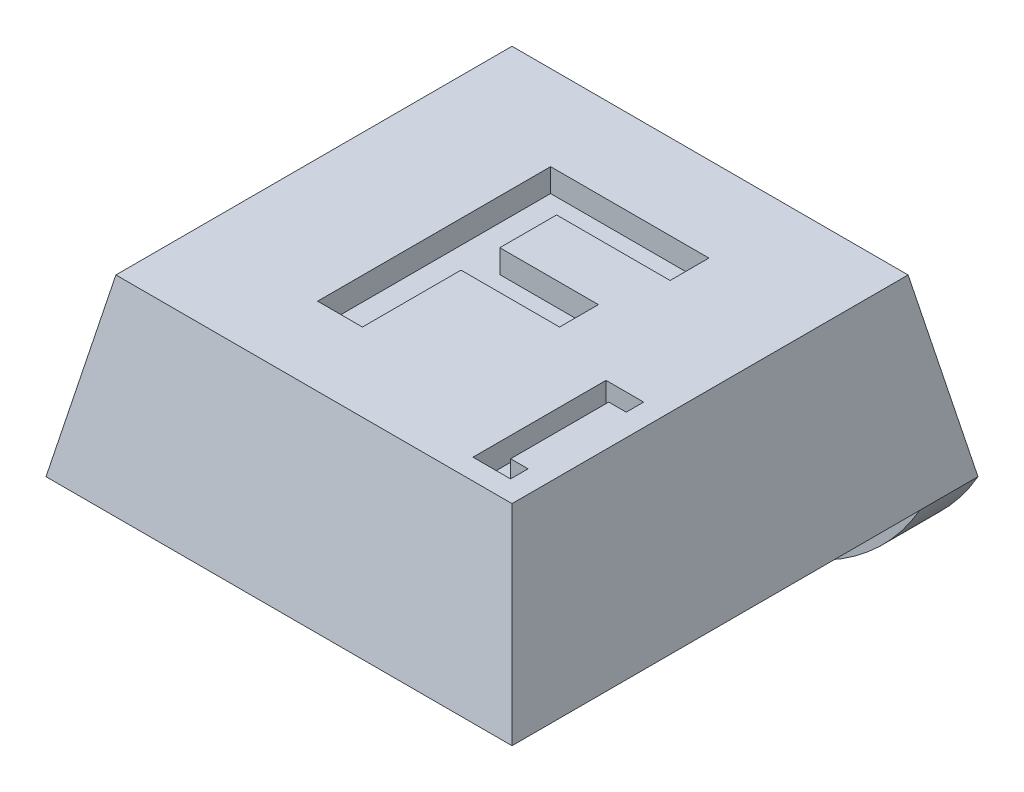
ISO-10303-21;
HEADER;
FILE_DESCRIPTION(('STEP AP214'),'2;1');
FILE_NAME('part.step','',(''),(''),'','','');
FILE_SCHEMA(('AUTOMOTIVE_DESIGN { 1 0 10303 214 1 1 1 1 }'));
ENDSEC;
DATA;
#1=APPLICATION_CONTEXT('core data for automotive mechanical design processes');
#2=APPLICATION_PROTOCOL_DEFINITION('international standard','automotive_design',2000,#1);
#3=PRODUCT_CONTEXT('',#1,'mechanical');
#4=PRODUCT('Part','Part','',(#3));
#5=PRODUCT_RELATED_PRODUCT_CATEGORY('part','',(#4));
#6=PRODUCT_DEFINITION_FORMATION('','',#4);
#7=PRODUCT_DEFINITION_CONTEXT('part definition',#1,'design');
#8=PRODUCT_DEFINITION('design','',#6,#7);
#9=PRODUCT_DEFINITION_SHAPE('','',#8);
#10=(LENGTH_UNIT() NAMED_UNIT(*) SI_UNIT(.MILLI.,.METRE.));
#11=(NAMED_UNIT(*) PLANE_ANGLE_UNIT() SI_UNIT($,.RADIAN.));
#12=(NAMED_UNIT(*) SI_UNIT($,.STERADIAN.) SOLID_ANGLE_UNIT());
#13=UNCERTAINTY_MEASURE_WITH_UNIT(LENGTH_MEASURE(1.E-05),#10,'distance_accuracy_value','');
#14=(GEOMETRIC_REPRESENTATION_CONTEXT(3) GLOBAL_UNCERTAINTY_ASSIGNED_CONTEXT((#13)) GLOBAL_UNIT_ASSIGNED_CONTEXT((#10,
#11,#12)) REPRESENTATION_CONTEXT('',''));
#15=CARTESIAN_POINT('',(0.,0.,0.));
#16=DIRECTION('',(0.,0.,1.));
#17=DIRECTION('',(1.,0.,0.));
#18=AXIS2_PLACEMENT_3D('',#15,#16,#17);
#19=CARTESIAN_POINT('',(0.,3.,0.));
#20=DIRECTION('',(0.,-1.,0.));
#21=DIRECTION('',(0.,0.,-1.));
#22=AXIS2_PLACEMENT_3D('',#19,#20,#21);
#23=PLANE('',#22);
#24=DIRECTION('',(-1.,0.,0.));
#25=VECTOR('',#24,1.);
#26=CARTESIAN_POINT('',(3.49080595744267,3.,-1.94116936627452));
#27=LINE('',#26,#25);
#28=CARTESIAN_POINT('',(3.49080595744267,3.,-1.94116936627452));
#29=VERTEX_POINT('',#28);
#30=CARTESIAN_POINT('',(2.7215751882119,3.,-1.94116936627452));
#31=VERTEX_POINT('',#30);
#32=EDGE_CURVE('E66',#29,#31,#27,.T.);
#33=ORIENTED_EDGE('',*,*,#32,.T.);
#34=DIRECTION('',(0.,0.,-1.));
#35=VECTOR('',#34,1.);
#36=CARTESIAN_POINT('',(2.7215751882119,3.,-1.94116936627452));
#37=LINE('',#36,#35);
#38=CARTESIAN_POINT('',(2.7215751882119,3.,-5.94116936627452));
#39=VERTEX_POINT('',#38);
#40=EDGE_CURVE('E239',#31,#39,#37,.T.);
#41=ORIENTED_EDGE('',*,*,#40,.T.);
#42=DIRECTION('',(1.,0.,0.));
#43=VECTOR('',#42,1.);
#44=CARTESIAN_POINT('',(2.7215751882119,3.,-5.94116936627452));
#45=LINE('',#44,#43);
#46=CARTESIAN_POINT('',(5.43952390616062,3.,-5.94116936627452));
#47=VERTEX_POINT('',#46);
#48=EDGE_CURVE('E281',#39,#47,#45,.T.);
#49=ORIENTED_EDGE('',*,*,#48,.T.);
#50=DIRECTION('',(0.,0.,1.));
#51=VECTOR('',#50,1.);
#52=CARTESIAN_POINT('',(5.43952390616062,3.,-5.94116936627452));
#53=LINE('',#52,#51);
#54=CARTESIAN_POINT('',(5.43952390616062,3.,-5.27450269960785));
#55=VERTEX_POINT('',#54);
#56=EDGE_CURVE('E285',#47,#55,#53,.T.);
#57=ORIENTED_EDGE('',*,*,#56,.T.);
#58=DIRECTION('',(-1.,0.,0.));
#59=VECTOR('',#58,1.);
#60=CARTESIAN_POINT('',(5.43952390616062,3.,-5.27450269960785));
#61=LINE('',#60,#59);
#62=CARTESIAN_POINT('',(3.49080595744267,3.,-5.27450269960785));
#63=VERTEX_POINT('',#62);
#64=EDGE_CURVE('E289',#55,#63,#61,.T.);
#65=ORIENTED_EDGE('',*,*,#64,.T.);
#66=DIRECTION('',(0.,0.,1.));
#67=VECTOR('',#66,1.);
#68=CARTESIAN_POINT('',(3.49080595744267,3.,-5.27450269960785));
#69=LINE('',#68,#67);
#70=CARTESIAN_POINT('',(3.49080595744267,3.,-4.30014372524888));
#71=VERTEX_POINT('',#70);
#72=EDGE_CURVE('E293',#63,#71,#69,.T.);
#73=ORIENTED_EDGE('',*,*,#72,.T.);
#74=DIRECTION('',(1.,0.,0.));
#75=VECTOR('',#74,1.);
#76=CARTESIAN_POINT('',(3.49080595744267,3.,-4.30014372524888));
#77=LINE('',#76,#75);
#78=CARTESIAN_POINT('',(5.18311364975036,3.,-4.30014372524888));
#79=VERTEX_POINT('',#78);
#80=EDGE_CURVE('E297',#71,#79,#77,.T.);
#81=ORIENTED_EDGE('',*,*,#80,.T.);
#82=DIRECTION('',(0.,0.,1.));
#83=VECTOR('',#82,1.);
#84=CARTESIAN_POINT('',(5.18311364975036,3.,-4.30014372524888));
#85=LINE('',#84,#83);
#86=CARTESIAN_POINT('',(5.18311364975036,3.,-3.63347705858221));
#87=VERTEX_POINT('',#86);
#88=EDGE_CURVE('E301',#79,#87,#85,.T.);
#89=ORIENTED_EDGE('',*,*,#88,.T.);
#90=DIRECTION('',(-1.,0.,0.));
#91=VECTOR('',#90,1.);
#92=CARTESIAN_POINT('',(5.18311364975036,3.,-3.63347705858221));
#93=LINE('',#92,#91);
#94=CARTESIAN_POINT('',(3.49080595744267,3.,-3.63347705858221));
#95=VERTEX_POINT('',#94);
#96=EDGE_CURVE('E305',#87,#95,#93,.T.);
#97=ORIENTED_EDGE('',*,*,#96,.T.);
#98=DIRECTION('',(0.,0.,1.));
#99=VECTOR('',#98,1.);
#100=CARTESIAN_POINT('',(3.49080595744267,3.,-3.63347705858221));
#101=LINE('',#100,#99);
#102=EDGE_CURVE('E250',#95,#29,#101,.T.);
#103=ORIENTED_EDGE('',*,*,#102,.T.);
#104=EDGE_LOOP('',(#33,#41,#49,#57,#65,#73,#81,#89,#97,#103));
#105=FACE_BOUND('',#104,.T.);
#106=DIRECTION('',(-1.,0.,0.));
#107=VECTOR('',#106,1.);
#108=CARTESIAN_POINT('',(11.,3.,-0.6));
#109=LINE('',#108,#107);
#110=CARTESIAN_POINT('',(7.4,3.,-0.6));
#111=VERTEX_POINT('',#110);
#112=CARTESIAN_POINT('',(0.6,3.,-0.6));
#113=VERTEX_POINT('',#112);
#114=EDGE_CURVE('E366',#111,#113,#109,.T.);
#115=ORIENTED_EDGE('',*,*,#114,.F.);
#116=DIRECTION('',(0.,0.,1.));
#117=VECTOR('',#116,1.);
#118=CARTESIAN_POINT('',(7.4,3.,-8.));
#119=LINE('',#118,#117);
#120=CARTESIAN_POINT('',(7.4,3.,-7.4));
#121=VERTEX_POINT('',#120);
#122=EDGE_CURVE('E379',#121,#111,#119,.T.);
#123=ORIENTED_EDGE('',*,*,#122,.F.);
#124=DIRECTION('',(-1.,0.,0.));
#125=VECTOR('',#124,1.);
#126=CARTESIAN_POINT('',(11.,3.,-7.4));
#127=LINE('',#126,#125);
#128=CARTESIAN_POINT('',(0.599999999999999,3.,-7.4));
#129=VERTEX_POINT('',#128);
#130=EDGE_CURVE('E362',#121,#129,#127,.T.);
#131=ORIENTED_EDGE('',*,*,#130,.T.);
#132=DIRECTION('',(0.,0.,1.));
#133=VECTOR('',#132,1.);
#134=CARTESIAN_POINT('',(0.6,3.,-8.));
#135=LINE('',#134,#133);
#136=EDGE_CURVE('E382',#129,#113,#135,.T.);
#137=ORIENTED_EDGE('',*,*,#136,.T.);
#138=EDGE_LOOP('',(#115,#123,#131,#137));
#139=FACE_BOUND('',#138,.T.);
#140=DIRECTION('',(-1.,0.,0.));
#141=VECTOR('',#140,1.);
#142=CARTESIAN_POINT('',(7.02065720821508,3.,-0.955347226257792));
#143=LINE('',#142,#141);
#144=CARTESIAN_POINT('',(7.02065720821508,3.,-0.955347226257792));
#145=VERTEX_POINT('',#144);
#146=CARTESIAN_POINT('',(6.37450336206124,3.,-0.955347226257792));
#147=VERTEX_POINT('',#146);
#148=EDGE_CURVE('E58',#145,#147,#143,.T.);
#149=ORIENTED_EDGE('',*,*,#148,.T.);
#150=DIRECTION('',(0.,0.,-1.));
#151=VECTOR('',#150,1.);
#152=CARTESIAN_POINT('',(6.37450336206124,3.,-0.955347226257792));
#153=LINE('',#152,#151);
#154=CARTESIAN_POINT('',(6.37450336206124,3.,-3.23996261087318));
#155=VERTEX_POINT('',#154);
#156=EDGE_CURVE('E233',#147,#155,#153,.T.);
#157=ORIENTED_EDGE('',*,*,#156,.T.);
#158=DIRECTION('',(1.,0.,0.));
#159=VECTOR('',#158,1.);
#160=CARTESIAN_POINT('',(6.37450336206124,3.,-3.23996261087318));
#161=LINE('',#160,#159);
#162=CARTESIAN_POINT('',(7.02065720821508,3.,-3.23996261087318));
#163=VERTEX_POINT('',#162);
#164=EDGE_CURVE('E486',#155,#163,#161,.T.);
#165=ORIENTED_EDGE('',*,*,#164,.T.);
#166=DIRECTION('',(0.,0.,1.));
#167=VECTOR('',#166,1.);
#168=CARTESIAN_POINT('',(7.02065720821508,3.,-3.23996261087318));
#169=LINE('',#168,#167);
#170=CARTESIAN_POINT('',(7.02065720821508,3.,-2.93996261087318));
#171=VERTEX_POINT('',#170);
#172=EDGE_CURVE('E494',#163,#171,#169,.T.);
#173=ORIENTED_EDGE('',*,*,#172,.T.);
#174=DIRECTION('',(-1.,0.,0.));
#175=VECTOR('',#174,1.);
#176=CARTESIAN_POINT('',(7.02065720821508,3.,-2.93996261087318));
#177=LINE('',#176,#175);
#178=CARTESIAN_POINT('',(6.72065720821508,3.,-2.93996261087318));
#179=VERTEX_POINT('',#178);
#180=EDGE_CURVE('E498',#171,#179,#177,.T.);
#181=ORIENTED_EDGE('',*,*,#180,.T.);
#182=DIRECTION('',(0.,0.,1.));
#183=VECTOR('',#182,1.);
#184=CARTESIAN_POINT('',(6.72065720821508,3.,-2.93996261087318));
#185=LINE('',#184,#183);
#186=CARTESIAN_POINT('',(6.72065720821508,3.,-1.25534722625779));
#187=VERTEX_POINT('',#186);
#188=EDGE_CURVE('E502',#179,#187,#185,.T.);
#189=ORIENTED_EDGE('',*,*,#188,.T.);
#190=DIRECTION('',(1.,0.,0.));
#191=VECTOR('',#190,1.);
#192=CARTESIAN_POINT('',(6.72065720821508,3.,-1.25534722625779));
#193=LINE('',#192,#191);
#194=CARTESIAN_POINT('',(7.02065720821508,3.,-1.25534722625779));
#195=VERTEX_POINT('',#194);
#196=EDGE_CURVE('E506',#187,#195,#193,.T.);
#197=ORIENTED_EDGE('',*,*,#196,.T.);
#198=DIRECTION('',(0.,0.,1.));
#199=VECTOR('',#198,1.);
#200=CARTESIAN_POINT('',(7.02065720821508,3.,-1.25534722625779));
#201=LINE('',#200,#199);
#202=EDGE_CURVE('E229',#195,#145,#201,.T.);
#203=ORIENTED_EDGE('',*,*,#202,.T.);
#204=EDGE_LOOP('',(#149,#157,#165,#173,#181,#189,#197,#203));
#205=FACE_BOUND('',#204,.T.);
#206=ADVANCED_FACE('F42',(#105,#139,#205),#23,.F.);
#207=CARTESIAN_POINT('',(8.,0.,-8.));
#208=DIRECTION('',(-0.98058067569092,-0.196116135138184,0.));
#209=DIRECTION('',(0.196116135138184,-0.98058067569092,0.));
#210=AXIS2_PLACEMENT_3D('',#207,#208,#209);
#211=PLANE('',#210);
#212=DIRECTION('',(-0.192450089729875,0.962250448649376,-0.192450089729875));
#213=VECTOR('',#212,1.);
#214=CARTESIAN_POINT('',(7.7037037037037,1.48148148148148,-0.296296296296296));
#215=LINE('',#214,#213);
#216=CARTESIAN_POINT('',(8.,0.,0.));
#217=VERTEX_POINT('',#216);
#218=EDGE_CURVE('E376',#217,#111,#215,.T.);
#219=ORIENTED_EDGE('',*,*,#218,.F.);
#220=DIRECTION('',(0.,0.,-1.));
#221=VECTOR('',#220,1.);
#222=CARTESIAN_POINT('',(8.,0.,0.));
#223=LINE('',#222,#221);
#224=CARTESIAN_POINT('',(8.,0.,-7.));
#225=VERTEX_POINT('',#224);
#226=EDGE_CURVE('E395',#217,#225,#223,.T.);
#227=ORIENTED_EDGE('',*,*,#226,.T.);
#228=DIRECTION('',(0.,0.,1.));
#229=VECTOR('',#228,1.);
#230=CARTESIAN_POINT('',(8.,0.,-8.));
#231=LINE('',#230,#229);
#232=CARTESIAN_POINT('',(8.,0.,-8.));
#233=VERTEX_POINT('',#232);
#234=EDGE_CURVE('E341',#233,#225,#231,.T.);
#235=ORIENTED_EDGE('',*,*,#234,.F.);
#236=DIRECTION('',(0.192450089729875,-0.962250448649376,-0.192450089729875));
#237=VECTOR('',#236,1.);
#238=CARTESIAN_POINT('',(8.,0.,-8.));
#239=LINE('',#238,#237);
#240=EDGE_CURVE('E369',#121,#233,#239,.T.);
#241=ORIENTED_EDGE('',*,*,#240,.F.);
#242=ORIENTED_EDGE('',*,*,#122,.T.);
#243=EDGE_LOOP('',(#219,#227,#235,#241,#242));
#244=FACE_BOUND('',#243,.T.);
#245=ADVANCED_FACE('F468',(#244),#211,.F.);
#246=CARTESIAN_POINT('',(0.,0.,-8.));
#247=DIRECTION('',(0.98058067569092,-0.196116135138184,0.));
#248=DIRECTION('',(0.196116135138184,0.98058067569092,0.));
#249=AXIS2_PLACEMENT_3D('',#246,#247,#248);
#250=PLANE('',#249);
#251=DIRECTION('',(-0.192450089729875,-0.962250448649376,0.192450089729875));
#252=VECTOR('',#251,1.);
#253=CARTESIAN_POINT('',(0.296296296296296,1.48148148148148,-0.296296296296296));
#254=LINE('',#253,#252);
#255=CARTESIAN_POINT('',(0.,0.,0.));
#256=VERTEX_POINT('',#255);
#257=EDGE_CURVE('E423',#113,#256,#254,.T.);
#258=ORIENTED_EDGE('',*,*,#257,.F.);
#259=ORIENTED_EDGE('',*,*,#136,.F.);
#260=DIRECTION('',(0.192450089729875,0.962250448649376,0.192450089729875));
#261=VECTOR('',#260,1.);
#262=CARTESIAN_POINT('',(0.,0.,-8.));
#263=LINE('',#262,#261);
#264=CARTESIAN_POINT('',(0.,0.,-8.));
#265=VERTEX_POINT('',#264);
#266=EDGE_CURVE('E394',#265,#129,#263,.T.);
#267=ORIENTED_EDGE('',*,*,#266,.F.);
#268=DIRECTION('',(0.,0.,1.));
#269=VECTOR('',#268,1.);
#270=CARTESIAN_POINT('',(0.,0.,0.));
#271=LINE('',#270,#269);
#272=CARTESIAN_POINT('',(0.,0.,-7.));
#273=VERTEX_POINT('',#272);
#274=EDGE_CURVE('E399',#265,#273,#271,.T.);
#275=ORIENTED_EDGE('',*,*,#274,.T.);
#276=EDGE_CURVE('E386',#273,#256,#271,.T.);
#277=ORIENTED_EDGE('',*,*,#276,.T.);
#278=EDGE_LOOP('',(#258,#259,#267,#275,#277));
#279=FACE_BOUND('',#278,.T.);
#280=ADVANCED_FACE('F448',(#279),#250,.F.);
#281=CARTESIAN_POINT('',(0.,0.,0.));
#282=DIRECTION('',(0.,-1.,0.));
#283=DIRECTION('',(0.,0.,-1.));
#284=AXIS2_PLACEMENT_3D('',#281,#282,#283);
#285=PLANE('',#284);
#286=DIRECTION('',(-1.,0.,0.));
#287=VECTOR('',#286,1.);
#288=CARTESIAN_POINT('',(0.,0.,-7.));
#289=LINE('',#288,#287);
#290=EDGE_CURVE('E347',#225,#273,#289,.T.);
#291=ORIENTED_EDGE('',*,*,#290,.F.);
#292=ORIENTED_EDGE('',*,*,#226,.F.);
#293=DIRECTION('',(1.,0.,0.));
#294=VECTOR('',#293,1.);
#295=CARTESIAN_POINT('',(0.,0.,0.));
#296=LINE('',#295,#294);
#297=EDGE_CURVE('E396',#256,#217,#296,.T.);
#298=ORIENTED_EDGE('',*,*,#297,.F.);
#299=ORIENTED_EDGE('',*,*,#276,.F.);
#300=EDGE_LOOP('',(#291,#292,#298,#299));
#301=FACE_BOUND('',#300,.T.);
#302=CARTESIAN_POINT('',(4.,0.,-3.75));
#303=DIRECTION('',(0.,-1.,0.));
#304=DIRECTION('',(0.,0.,-1.));
#305=AXIS2_PLACEMENT_3D('',#302,#303,#304);
#306=CIRCLE('',#305,1.8);
#307=CARTESIAN_POINT('',(4.,0.,-5.55));
#308=VERTEX_POINT('',#307);
#309=EDGE_CURVE('E351',#308,#308,#306,.T.);
#310=ORIENTED_EDGE('',*,*,#309,.F.);
#311=EDGE_LOOP('',(#310));
#312=FACE_BOUND('',#311,.T.);
#313=ADVANCED_FACE('F463',(#301,#312),#285,.T.);
#314=CARTESIAN_POINT('',(11.,3.,-7.4));
#315=DIRECTION('',(0.,0.196116135138184,-0.98058067569092));
#316=DIRECTION('',(0.,0.98058067569092,0.196116135138184));
#317=AXIS2_PLACEMENT_3D('',#314,#315,#316);
#318=PLANE('',#317);
#319=ORIENTED_EDGE('',*,*,#240,.T.);
#320=DIRECTION('',(-1.,0.,0.));
#321=VECTOR('',#320,1.);
#322=CARTESIAN_POINT('',(0.,0.,-8.));
#323=LINE('',#322,#321);
#324=EDGE_CURVE('E390',#233,#265,#323,.T.);
#325=ORIENTED_EDGE('',*,*,#324,.T.);
#326=ORIENTED_EDGE('',*,*,#266,.T.);
#327=ORIENTED_EDGE('',*,*,#130,.F.);
#328=EDGE_LOOP('',(#319,#325,#326,#327));
#329=FACE_BOUND('',#328,.T.);
#330=ADVANCED_FACE('F443',(#329),#318,.T.);
#331=CARTESIAN_POINT('',(11.,0.,0.));
#332=DIRECTION('',(0.,0.196116135138184,0.98058067569092));
#333=DIRECTION('',(0.,-0.98058067569092,0.196116135138184));
#334=AXIS2_PLACEMENT_3D('',#331,#332,#333);
#335=PLANE('',#334);
#336=ORIENTED_EDGE('',*,*,#218,.T.);
#337=ORIENTED_EDGE('',*,*,#114,.T.);
#338=ORIENTED_EDGE('',*,*,#257,.T.);
#339=ORIENTED_EDGE('',*,*,#297,.T.);
#340=EDGE_LOOP('',(#336,#337,#338,#339));
#341=FACE_BOUND('',#340,.T.);
#342=ADVANCED_FACE('F472',(#341),#335,.T.);
#343=CARTESIAN_POINT('',(4.,0.8,-3.75));
#344=DIRECTION('',(0.,-1.,0.));
#345=DIRECTION('',(0.,0.,-1.));
#346=AXIS2_PLACEMENT_3D('',#343,#344,#345);
#347=CYLINDRICAL_SURFACE('',#346,1.8);
#348=CARTESIAN_POINT('',(4.,0.8,-3.75));
#349=DIRECTION('',(0.,-1.,0.));
#350=DIRECTION('',(0.,0.,-1.));
#351=AXIS2_PLACEMENT_3D('',#348,#349,#350);
#352=CIRCLE('',#351,1.8);
#353=CARTESIAN_POINT('',(4.,0.8,-5.55));
#354=VERTEX_POINT('',#353);
#355=EDGE_CURVE('E358',#354,#354,#352,.T.);
#356=ORIENTED_EDGE('',*,*,#355,.F.);
#357=EDGE_LOOP('',(#356));
#358=FACE_BOUND('',#357,.T.);
#359=ORIENTED_EDGE('',*,*,#309,.T.);
#360=EDGE_LOOP('',(#359));
#361=FACE_BOUND('',#360,.T.);
#362=ADVANCED_FACE('F637',(#358,#361),#347,.F.);
#363=CARTESIAN_POINT('',(4.,0.8,-3.75));
#364=DIRECTION('',(0.,-1.,0.));
#365=DIRECTION('',(0.,0.,-1.));
#366=AXIS2_PLACEMENT_3D('',#363,#364,#365);
#367=PLANE('',#366);
#368=ORIENTED_EDGE('',*,*,#355,.T.);
#369=EDGE_LOOP('',(#368));
#370=FACE_BOUND('',#369,.T.);
#371=ADVANCED_FACE('F634',(#370),#367,.T.);
#372=CARTESIAN_POINT('',(0.,-2.,-8.));
#373=DIRECTION('',(0.,0.,1.));
#374=DIRECTION('',(1.,0.,0.));
#375=AXIS2_PLACEMENT_3D('',#372,#373,#374);
#376=PLANE('',#375);
#377=ORIENTED_EDGE('',*,*,#324,.F.);
#378=CARTESIAN_POINT('',(4.53589838486225,2.,-8.));
#379=DIRECTION('',(0.,0.,1.));
#380=DIRECTION('',(1.,0.,0.));
#381=AXIS2_PLACEMENT_3D('',#378,#379,#380);
#382=CIRCLE('',#381,4.);
#383=CARTESIAN_POINT('',(4.53589838486225,-2.,-8.));
#384=VERTEX_POINT('',#383);
#385=EDGE_CURVE('E11',#233,#384,#382,.F.);
#386=ORIENTED_EDGE('',*,*,#385,.T.);
#387=DIRECTION('',(1.,0.,0.));
#388=VECTOR('',#387,1.);
#389=CARTESIAN_POINT('',(0.,-2.,-8.));
#390=LINE('',#389,#388);
#391=CARTESIAN_POINT('',(3.46410161513775,-2.,-8.));
#392=VERTEX_POINT('',#391);
#393=EDGE_CURVE('E342',#392,#384,#390,.T.);
#394=ORIENTED_EDGE('',*,*,#393,.F.);
#395=CARTESIAN_POINT('',(3.46410161513775,2.,-8.));
#396=DIRECTION('',(0.,0.,1.));
#397=DIRECTION('',(1.,0.,0.));
#398=AXIS2_PLACEMENT_3D('',#395,#396,#397);
#399=CIRCLE('',#398,4.);
#400=EDGE_CURVE('E51',#392,#265,#399,.F.);
#401=ORIENTED_EDGE('',*,*,#400,.T.);
#402=EDGE_LOOP('',(#377,#386,#394,#401));
#403=FACE_BOUND('',#402,.T.);
#404=ADVANCED_FACE('F436',(#403),#376,.F.);
#405=CARTESIAN_POINT('',(0.,-2.,-7.));
#406=DIRECTION('',(0.,0.,-1.));
#407=DIRECTION('',(-1.,0.,0.));
#408=AXIS2_PLACEMENT_3D('',#405,#406,#407);
#409=PLANE('',#408);
#410=DIRECTION('',(-1.,0.,0.));
#411=VECTOR('',#410,1.);
#412=CARTESIAN_POINT('',(0.,-2.,-7.));
#413=LINE('',#412,#411);
#414=CARTESIAN_POINT('',(4.53589838486225,-2.,-7.));
#415=VERTEX_POINT('',#414);
#416=CARTESIAN_POINT('',(3.46410161513775,-2.,-7.));
#417=VERTEX_POINT('',#416);
#418=EDGE_CURVE('E346',#415,#417,#413,.T.);
#419=ORIENTED_EDGE('',*,*,#418,.F.);
#420=CARTESIAN_POINT('',(4.53589838486225,2.,-7.));
#421=DIRECTION('',(0.,0.,-1.));
#422=DIRECTION('',(-1.,0.,0.));
#423=AXIS2_PLACEMENT_3D('',#420,#421,#422);
#424=CIRCLE('',#423,4.);
#425=EDGE_CURVE('E430',#415,#225,#424,.F.);
#426=ORIENTED_EDGE('',*,*,#425,.T.);
#427=ORIENTED_EDGE('',*,*,#290,.T.);
#428=CARTESIAN_POINT('',(3.46410161513775,2.,-7.));
#429=DIRECTION('',(0.,0.,-1.));
#430=DIRECTION('',(-1.,0.,0.));
#431=AXIS2_PLACEMENT_3D('',#428,#429,#430);
#432=CIRCLE('',#431,4.);
#433=EDGE_CURVE('E427',#273,#417,#432,.F.);
#434=ORIENTED_EDGE('',*,*,#433,.T.);
#435=EDGE_LOOP('',(#419,#426,#427,#434));
#436=FACE_BOUND('',#435,.T.);
#437=ADVANCED_FACE('F454',(#436),#409,.F.);
#438=CARTESIAN_POINT('',(0.,-2.,0.));
#439=DIRECTION('',(0.,1.,0.));
#440=DIRECTION('',(0.,0.,1.));
#441=AXIS2_PLACEMENT_3D('',#438,#439,#440);
#442=PLANE('',#441);
#443=ORIENTED_EDGE('',*,*,#393,.T.);
#444=DIRECTION('',(0.,0.,1.));
#445=VECTOR('',#444,1.);
#446=CARTESIAN_POINT('',(4.53589838486225,-2.,0.));
#447=LINE('',#446,#445);
#448=EDGE_CURVE('E422',#384,#415,#447,.T.);
#449=ORIENTED_EDGE('',*,*,#448,.T.);
#450=ORIENTED_EDGE('',*,*,#418,.T.);
#451=DIRECTION('',(0.,0.,-1.));
#452=VECTOR('',#451,1.);
#453=CARTESIAN_POINT('',(3.46410161513775,-2.,0.));
#454=LINE('',#453,#452);
#455=EDGE_CURVE('E418',#417,#392,#454,.T.);
#456=ORIENTED_EDGE('',*,*,#455,.T.);
#457=EDGE_LOOP('',(#443,#449,#450,#456));
#458=FACE_BOUND('',#457,.T.);
#459=ADVANCED_FACE('F457',(#458),#442,.F.);
#460=CARTESIAN_POINT('',(4.53589838486225,2.,-8.));
#461=DIRECTION('',(0.,0.,1.));
#462=DIRECTION('',(1.,0.,0.));
#463=AXIS2_PLACEMENT_3D('',#460,#461,#462);
#464=CYLINDRICAL_SURFACE('',#463,4.);
#465=ORIENTED_EDGE('',*,*,#385,.F.);
#466=ORIENTED_EDGE('',*,*,#234,.T.);
#467=ORIENTED_EDGE('',*,*,#425,.F.);
#468=ORIENTED_EDGE('',*,*,#448,.F.);
#469=EDGE_LOOP('',(#465,#466,#467,#468));
#470=FACE_BOUND('',#469,.T.);
#471=ADVANCED_FACE('F460',(#470),#464,.T.);
#472=CARTESIAN_POINT('',(3.46410161513775,2.,-8.));
#473=DIRECTION('',(0.,0.,-1.));
#474=DIRECTION('',(-1.,0.,0.));
#475=AXIS2_PLACEMENT_3D('',#472,#473,#474);
#476=CYLINDRICAL_SURFACE('',#475,4.);
#477=ORIENTED_EDGE('',*,*,#433,.F.);
#478=ORIENTED_EDGE('',*,*,#274,.F.);
#479=ORIENTED_EDGE('',*,*,#400,.F.);
#480=ORIENTED_EDGE('',*,*,#455,.F.);
#481=EDGE_LOOP('',(#477,#478,#479,#480));
#482=FACE_BOUND('',#481,.T.);
#483=ADVANCED_FACE('F44',(#482),#476,.T.);
#484=CARTESIAN_POINT('',(3.49080595744267,2.6,-1.94116936627452));
#485=DIRECTION('',(0.,0.,-1.));
#486=DIRECTION('',(-1.,0.,0.));
#487=AXIS2_PLACEMENT_3D('',#484,#485,#486);
#488=PLANE('',#487);
#489=ORIENTED_EDGE('',*,*,#32,.F.);
#490=DIRECTION('',(0.,1.,0.));
#491=VECTOR('',#490,1.);
#492=CARTESIAN_POINT('',(3.49080595744267,2.6,-1.94116936627452));
#493=LINE('',#492,#491);
#494=CARTESIAN_POINT('',(3.49080595744267,2.6,-1.94116936627452));
#495=VERTEX_POINT('',#494);
#496=EDGE_CURVE('E276',#495,#29,#493,.T.);
#497=ORIENTED_EDGE('',*,*,#496,.F.);
#498=DIRECTION('',(-1.,0.,0.));
#499=VECTOR('',#498,1.);
#500=CARTESIAN_POINT('',(3.49080595744267,2.6,-1.94116936627452));
#501=LINE('',#500,#499);
#502=CARTESIAN_POINT('',(2.7215751882119,2.6,-1.94116936627452));
#503=VERTEX_POINT('',#502);
#504=EDGE_CURVE('E245',#495,#503,#501,.T.);
#505=ORIENTED_EDGE('',*,*,#504,.T.);
#506=DIRECTION('',(0.,1.,0.));
#507=VECTOR('',#506,1.);
#508=CARTESIAN_POINT('',(2.7215751882119,2.6,-1.94116936627452));
#509=LINE('',#508,#507);
#510=EDGE_CURVE('E338',#503,#31,#509,.T.);
#511=ORIENTED_EDGE('',*,*,#510,.T.);
#512=EDGE_LOOP('',(#489,#497,#505,#511));
#513=FACE_BOUND('',#512,.T.);
#514=ADVANCED_FACE('F624',(#513),#488,.T.);
#515=CARTESIAN_POINT('',(2.7215751882119,2.6,-1.94116936627452));
#516=DIRECTION('',(1.,0.,0.));
#517=DIRECTION('',(0.,0.,-1.));
#518=AXIS2_PLACEMENT_3D('',#515,#516,#517);
#519=PLANE('',#518);
#520=ORIENTED_EDGE('',*,*,#40,.F.);
#521=ORIENTED_EDGE('',*,*,#510,.F.);
#522=DIRECTION('',(0.,0.,-1.));
#523=VECTOR('',#522,1.);
#524=CARTESIAN_POINT('',(2.7215751882119,2.6,-1.94116936627452));
#525=LINE('',#524,#523);
#526=CARTESIAN_POINT('',(2.7215751882119,2.6,-5.94116936627452));
#527=VERTEX_POINT('',#526);
#528=EDGE_CURVE('E249',#503,#527,#525,.T.);
#529=ORIENTED_EDGE('',*,*,#528,.T.);
#530=DIRECTION('',(0.,1.,0.));
#531=VECTOR('',#530,1.);
#532=CARTESIAN_POINT('',(2.7215751882119,2.6,-5.94116936627452));
#533=LINE('',#532,#531);
#534=EDGE_CURVE('E335',#527,#39,#533,.T.);
#535=ORIENTED_EDGE('',*,*,#534,.T.);
#536=EDGE_LOOP('',(#520,#521,#529,#535));
#537=FACE_BOUND('',#536,.T.);
#538=ADVANCED_FACE('F620',(#537),#519,.T.);
#539=CARTESIAN_POINT('',(2.7215751882119,2.6,-5.94116936627452));
#540=DIRECTION('',(0.,0.,1.));
#541=DIRECTION('',(1.,0.,0.));
#542=AXIS2_PLACEMENT_3D('',#539,#540,#541);
#543=PLANE('',#542);
#544=ORIENTED_EDGE('',*,*,#48,.F.);
#545=ORIENTED_EDGE('',*,*,#534,.F.);
#546=DIRECTION('',(1.,0.,0.));
#547=VECTOR('',#546,1.);
#548=CARTESIAN_POINT('',(2.7215751882119,2.6,-5.94116936627452));
#549=LINE('',#548,#547);
#550=CARTESIAN_POINT('',(5.43952390616062,2.6,-5.94116936627452));
#551=VERTEX_POINT('',#550);
#552=EDGE_CURVE('E253',#527,#551,#549,.T.);
#553=ORIENTED_EDGE('',*,*,#552,.T.);
#554=DIRECTION('',(0.,1.,0.));
#555=VECTOR('',#554,1.);
#556=CARTESIAN_POINT('',(5.43952390616062,2.6,-5.94116936627452));
#557=LINE('',#556,#555);
#558=EDGE_CURVE('E332',#551,#47,#557,.T.);
#559=ORIENTED_EDGE('',*,*,#558,.T.);
#560=EDGE_LOOP('',(#544,#545,#553,#559));
#561=FACE_BOUND('',#560,.T.);
#562=ADVANCED_FACE('F616',(#561),#543,.T.);
#563=CARTESIAN_POINT('',(5.43952390616062,2.6,-5.94116936627452));
#564=DIRECTION('',(-1.,0.,0.));
#565=DIRECTION('',(0.,0.,1.));
#566=AXIS2_PLACEMENT_3D('',#563,#564,#565);
#567=PLANE('',#566);
#568=ORIENTED_EDGE('',*,*,#56,.F.);
#569=ORIENTED_EDGE('',*,*,#558,.F.);
#570=DIRECTION('',(0.,0.,1.));
#571=VECTOR('',#570,1.);
#572=CARTESIAN_POINT('',(5.43952390616062,2.6,-5.94116936627452));
#573=LINE('',#572,#571);
#574=CARTESIAN_POINT('',(5.43952390616062,2.6,-5.27450269960785));
#575=VERTEX_POINT('',#574);
#576=EDGE_CURVE('E256',#551,#575,#573,.T.);
#577=ORIENTED_EDGE('',*,*,#576,.T.);
#578=DIRECTION('',(0.,1.,0.));
#579=VECTOR('',#578,1.);
#580=CARTESIAN_POINT('',(5.43952390616062,2.6,-5.27450269960785));
#581=LINE('',#580,#579);
#582=EDGE_CURVE('E329',#575,#55,#581,.T.);
#583=ORIENTED_EDGE('',*,*,#582,.T.);
#584=EDGE_LOOP('',(#568,#569,#577,#583));
#585=FACE_BOUND('',#584,.T.);
#586=ADVANCED_FACE('F612',(#585),#567,.T.);
#587=CARTESIAN_POINT('',(5.43952390616062,2.6,-5.27450269960785));
#588=DIRECTION('',(0.,0.,-1.));
#589=DIRECTION('',(-1.,0.,0.));
#590=AXIS2_PLACEMENT_3D('',#587,#588,#589);
#591=PLANE('',#590);
#592=ORIENTED_EDGE('',*,*,#64,.F.);
#593=ORIENTED_EDGE('',*,*,#582,.F.);
#594=DIRECTION('',(-1.,0.,0.));
#595=VECTOR('',#594,1.);
#596=CARTESIAN_POINT('',(5.43952390616062,2.6,-5.27450269960785));
#597=LINE('',#596,#595);
#598=CARTESIAN_POINT('',(3.49080595744267,2.6,-5.27450269960785));
#599=VERTEX_POINT('',#598);
#600=EDGE_CURVE('E259',#575,#599,#597,.T.);
#601=ORIENTED_EDGE('',*,*,#600,.T.);
#602=DIRECTION('',(0.,1.,0.));
#603=VECTOR('',#602,1.);
#604=CARTESIAN_POINT('',(3.49080595744267,2.6,-5.27450269960785));
#605=LINE('',#604,#603);
#606=EDGE_CURVE('E326',#599,#63,#605,.T.);
#607=ORIENTED_EDGE('',*,*,#606,.T.);
#608=EDGE_LOOP('',(#592,#593,#601,#607));
#609=FACE_BOUND('',#608,.T.);
#610=ADVANCED_FACE('F608',(#609),#591,.T.);
#611=CARTESIAN_POINT('',(3.49080595744267,2.6,-5.27450269960785));
#612=DIRECTION('',(-1.,0.,0.));
#613=DIRECTION('',(0.,0.,1.));
#614=AXIS2_PLACEMENT_3D('',#611,#612,#613);
#615=PLANE('',#614);
#616=ORIENTED_EDGE('',*,*,#72,.F.);
#617=ORIENTED_EDGE('',*,*,#606,.F.);
#618=DIRECTION('',(0.,0.,1.));
#619=VECTOR('',#618,1.);
#620=CARTESIAN_POINT('',(3.49080595744267,2.6,-5.27450269960785));
#621=LINE('',#620,#619);
#622=CARTESIAN_POINT('',(3.49080595744267,2.6,-4.30014372524888));
#623=VERTEX_POINT('',#622);
#624=EDGE_CURVE('E262',#599,#623,#621,.T.);
#625=ORIENTED_EDGE('',*,*,#624,.T.);
#626=DIRECTION('',(0.,1.,0.));
#627=VECTOR('',#626,1.);
#628=CARTESIAN_POINT('',(3.49080595744267,2.6,-4.30014372524888));
#629=LINE('',#628,#627);
#630=EDGE_CURVE('E323',#623,#71,#629,.T.);
#631=ORIENTED_EDGE('',*,*,#630,.T.);
#632=EDGE_LOOP('',(#616,#617,#625,#631));
#633=FACE_BOUND('',#632,.T.);
#634=ADVANCED_FACE('F604',(#633),#615,.T.);
#635=CARTESIAN_POINT('',(3.49080595744267,2.6,-4.30014372524888));
#636=DIRECTION('',(0.,0.,1.));
#637=DIRECTION('',(1.,0.,0.));
#638=AXIS2_PLACEMENT_3D('',#635,#636,#637);
#639=PLANE('',#638);
#640=ORIENTED_EDGE('',*,*,#80,.F.);
#641=ORIENTED_EDGE('',*,*,#630,.F.);
#642=DIRECTION('',(1.,0.,0.));
#643=VECTOR('',#642,1.);
#644=CARTESIAN_POINT('',(3.49080595744267,2.6,-4.30014372524888));
#645=LINE('',#644,#643);
#646=CARTESIAN_POINT('',(5.18311364975036,2.6,-4.30014372524888));
#647=VERTEX_POINT('',#646);
#648=EDGE_CURVE('E265',#623,#647,#645,.T.);
#649=ORIENTED_EDGE('',*,*,#648,.T.);
#650=DIRECTION('',(0.,1.,0.));
#651=VECTOR('',#650,1.);
#652=CARTESIAN_POINT('',(5.18311364975036,2.6,-4.30014372524888));
#653=LINE('',#652,#651);
#654=EDGE_CURVE('E320',#647,#79,#653,.T.);
#655=ORIENTED_EDGE('',*,*,#654,.T.);
#656=EDGE_LOOP('',(#640,#641,#649,#655));
#657=FACE_BOUND('',#656,.T.);
#658=ADVANCED_FACE('F600',(#657),#639,.T.);
#659=CARTESIAN_POINT('',(5.18311364975036,2.6,-4.30014372524888));
#660=DIRECTION('',(-1.,0.,0.));
#661=DIRECTION('',(0.,0.,1.));
#662=AXIS2_PLACEMENT_3D('',#659,#660,#661);
#663=PLANE('',#662);
#664=ORIENTED_EDGE('',*,*,#88,.F.);
#665=ORIENTED_EDGE('',*,*,#654,.F.);
#666=DIRECTION('',(0.,0.,1.));
#667=VECTOR('',#666,1.);
#668=CARTESIAN_POINT('',(5.18311364975036,2.6,-4.30014372524888));
#669=LINE('',#668,#667);
#670=CARTESIAN_POINT('',(5.18311364975036,2.6,-3.63347705858221));
#671=VERTEX_POINT('',#670);
#672=EDGE_CURVE('E268',#647,#671,#669,.T.);
#673=ORIENTED_EDGE('',*,*,#672,.T.);
#674=DIRECTION('',(0.,1.,0.));
#675=VECTOR('',#674,1.);
#676=CARTESIAN_POINT('',(5.18311364975036,2.6,-3.63347705858221));
#677=LINE('',#676,#675);
#678=EDGE_CURVE('E317',#671,#87,#677,.T.);
#679=ORIENTED_EDGE('',*,*,#678,.T.);
#680=EDGE_LOOP('',(#664,#665,#673,#679));
#681=FACE_BOUND('',#680,.T.);
#682=ADVANCED_FACE('F596',(#681),#663,.T.);
#683=CARTESIAN_POINT('',(5.18311364975036,2.6,-3.63347705858221));
#684=DIRECTION('',(0.,0.,-1.));
#685=DIRECTION('',(-1.,0.,0.));
#686=AXIS2_PLACEMENT_3D('',#683,#684,#685);
#687=PLANE('',#686);
#688=ORIENTED_EDGE('',*,*,#96,.F.);
#689=ORIENTED_EDGE('',*,*,#678,.F.);
#690=DIRECTION('',(-1.,0.,0.));
#691=VECTOR('',#690,1.);
#692=CARTESIAN_POINT('',(5.18311364975036,2.6,-3.63347705858221));
#693=LINE('',#692,#691);
#694=CARTESIAN_POINT('',(3.49080595744267,2.6,-3.63347705858221));
#695=VERTEX_POINT('',#694);
#696=EDGE_CURVE('E271',#671,#695,#693,.T.);
#697=ORIENTED_EDGE('',*,*,#696,.T.);
#698=DIRECTION('',(0.,1.,0.));
#699=VECTOR('',#698,1.);
#700=CARTESIAN_POINT('',(3.49080595744267,2.6,-3.63347705858221));
#701=LINE('',#700,#699);
#702=EDGE_CURVE('E314',#695,#95,#701,.T.);
#703=ORIENTED_EDGE('',*,*,#702,.T.);
#704=EDGE_LOOP('',(#688,#689,#697,#703));
#705=FACE_BOUND('',#704,.T.);
#706=ADVANCED_FACE('F592',(#705),#687,.T.);
#707=CARTESIAN_POINT('',(3.49080595744267,2.6,-3.63347705858221));
#708=DIRECTION('',(-1.,0.,0.));
#709=DIRECTION('',(0.,0.,1.));
#710=AXIS2_PLACEMENT_3D('',#707,#708,#709);
#711=PLANE('',#710);
#712=ORIENTED_EDGE('',*,*,#102,.F.);
#713=ORIENTED_EDGE('',*,*,#702,.F.);
#714=DIRECTION('',(0.,0.,1.));
#715=VECTOR('',#714,1.);
#716=CARTESIAN_POINT('',(3.49080595744267,2.6,-3.63347705858221));
#717=LINE('',#716,#715);
#718=EDGE_CURVE('E274',#695,#495,#717,.T.);
#719=ORIENTED_EDGE('',*,*,#718,.T.);
#720=ORIENTED_EDGE('',*,*,#496,.T.);
#721=EDGE_LOOP('',(#712,#713,#719,#720));
#722=FACE_BOUND('',#721,.T.);
#723=ADVANCED_FACE('F588',(#722),#711,.T.);
#724=CARTESIAN_POINT('',(0.,2.6,0.));
#725=DIRECTION('',(0.,-1.,0.));
#726=DIRECTION('',(0.,0.,-1.));
#727=AXIS2_PLACEMENT_3D('',#724,#725,#726);
#728=PLANE('',#727);
#729=ORIENTED_EDGE('',*,*,#504,.F.);
#730=ORIENTED_EDGE('',*,*,#718,.F.);
#731=ORIENTED_EDGE('',*,*,#696,.F.);
#732=ORIENTED_EDGE('',*,*,#672,.F.);
#733=ORIENTED_EDGE('',*,*,#648,.F.);
#734=ORIENTED_EDGE('',*,*,#624,.F.);
#735=ORIENTED_EDGE('',*,*,#600,.F.);
#736=ORIENTED_EDGE('',*,*,#576,.F.);
#737=ORIENTED_EDGE('',*,*,#552,.F.);
#738=ORIENTED_EDGE('',*,*,#528,.F.);
#739=EDGE_LOOP('',(#729,#730,#731,#732,#733,#734,#735,#736,#737,#738));
#740=FACE_BOUND('',#739,.T.);
#741=ADVANCED_FACE('F585',(#740),#728,.F.);
#742=CARTESIAN_POINT('',(7.02065720821508,2.6,-0.955347226257792));
#743=DIRECTION('',(0.,0.,-1.));
#744=DIRECTION('',(-1.,0.,0.));
#745=AXIS2_PLACEMENT_3D('',#742,#743,#744);
#746=PLANE('',#745);
#747=ORIENTED_EDGE('',*,*,#148,.F.);
#748=DIRECTION('',(0.,1.,0.));
#749=VECTOR('',#748,1.);
#750=CARTESIAN_POINT('',(7.02065720821508,2.6,-0.955347226257792));
#751=LINE('',#750,#749);
#752=CARTESIAN_POINT('',(7.02065720821508,2.6,-0.955347226257792));
#753=VERTEX_POINT('',#752);
#754=EDGE_CURVE('E227',#753,#145,#751,.T.);
#755=ORIENTED_EDGE('',*,*,#754,.F.);
#756=DIRECTION('',(-1.,0.,0.));
#757=VECTOR('',#756,1.);
#758=CARTESIAN_POINT('',(7.02065720821508,2.6,-0.955347226257792));
#759=LINE('',#758,#757);
#760=CARTESIAN_POINT('',(6.37450336206124,2.6,-0.955347226257792));
#761=VERTEX_POINT('',#760);
#762=EDGE_CURVE('E217',#753,#761,#759,.T.);
#763=ORIENTED_EDGE('',*,*,#762,.T.);
#764=DIRECTION('',(0.,1.,0.));
#765=VECTOR('',#764,1.);
#766=CARTESIAN_POINT('',(6.37450336206124,2.6,-0.955347226257792));
#767=LINE('',#766,#765);
#768=EDGE_CURVE('E226',#761,#147,#767,.T.);
#769=ORIENTED_EDGE('',*,*,#768,.T.);
#770=EDGE_LOOP('',(#747,#755,#763,#769));
#771=FACE_BOUND('',#770,.T.);
#772=ADVANCED_FACE('F225',(#771),#746,.T.);
#773=CARTESIAN_POINT('',(6.37450336206124,2.6,-0.955347226257792));
#774=DIRECTION('',(1.,0.,0.));
#775=DIRECTION('',(0.,0.,-1.));
#776=AXIS2_PLACEMENT_3D('',#773,#774,#775);
#777=PLANE('',#776);
#778=ORIENTED_EDGE('',*,*,#156,.F.);
#779=ORIENTED_EDGE('',*,*,#768,.F.);
#780=DIRECTION('',(0.,0.,-1.));
#781=VECTOR('',#780,1.);
#782=CARTESIAN_POINT('',(6.37450336206124,2.6,-0.955347226257792));
#783=LINE('',#782,#781);
#784=CARTESIAN_POINT('',(6.37450336206124,2.6,-3.23996261087318));
#785=VERTEX_POINT('',#784);
#786=EDGE_CURVE('E213',#761,#785,#783,.T.);
#787=ORIENTED_EDGE('',*,*,#786,.T.);
#788=DIRECTION('',(0.,1.,0.));
#789=VECTOR('',#788,1.);
#790=CARTESIAN_POINT('',(6.37450336206124,2.6,-3.23996261087318));
#791=LINE('',#790,#789);
#792=EDGE_CURVE('E235',#785,#155,#791,.T.);
#793=ORIENTED_EDGE('',*,*,#792,.T.);
#794=EDGE_LOOP('',(#778,#779,#787,#793));
#795=FACE_BOUND('',#794,.T.);
#796=ADVANCED_FACE('F231',(#795),#777,.T.);
#797=CARTESIAN_POINT('',(6.37450336206124,2.6,-3.23996261087318));
#798=DIRECTION('',(0.,0.,1.));
#799=DIRECTION('',(1.,0.,0.));
#800=AXIS2_PLACEMENT_3D('',#797,#798,#799);
#801=PLANE('',#800);
#802=ORIENTED_EDGE('',*,*,#164,.F.);
#803=ORIENTED_EDGE('',*,*,#792,.F.);
#804=DIRECTION('',(1.,0.,0.));
#805=VECTOR('',#804,1.);
#806=CARTESIAN_POINT('',(6.37450336206124,2.6,-3.23996261087318));
#807=LINE('',#806,#805);
#808=CARTESIAN_POINT('',(7.02065720821508,2.6,-3.23996261087318));
#809=VERTEX_POINT('',#808);
#810=EDGE_CURVE('E219',#785,#809,#807,.T.);
#811=ORIENTED_EDGE('',*,*,#810,.T.);
#812=DIRECTION('',(0.,1.,0.));
#813=VECTOR('',#812,1.);
#814=CARTESIAN_POINT('',(7.02065720821508,2.6,-3.23996261087318));
#815=LINE('',#814,#813);
#816=EDGE_CURVE('E241',#809,#163,#815,.T.);
#817=ORIENTED_EDGE('',*,*,#816,.T.);
#818=EDGE_LOOP('',(#802,#803,#811,#817));
#819=FACE_BOUND('',#818,.T.);
#820=ADVANCED_FACE('F529',(#819),#801,.T.);
#821=CARTESIAN_POINT('',(7.02065720821508,2.6,-3.23996261087318));
#822=DIRECTION('',(-1.,0.,0.));
#823=DIRECTION('',(0.,0.,1.));
#824=AXIS2_PLACEMENT_3D('',#821,#822,#823);
#825=PLANE('',#824);
#826=ORIENTED_EDGE('',*,*,#172,.F.);
#827=ORIENTED_EDGE('',*,*,#816,.F.);
#828=DIRECTION('',(0.,0.,1.));
#829=VECTOR('',#828,1.);
#830=CARTESIAN_POINT('',(7.02065720821508,2.6,-3.23996261087318));
#831=LINE('',#830,#829);
#832=CARTESIAN_POINT('',(7.02065720821508,2.6,-2.93996261087318));
#833=VERTEX_POINT('',#832);
#834=EDGE_CURVE('E560',#809,#833,#831,.T.);
#835=ORIENTED_EDGE('',*,*,#834,.T.);
#836=DIRECTION('',(0.,1.,0.));
#837=VECTOR('',#836,1.);
#838=CARTESIAN_POINT('',(7.02065720821508,2.6,-2.93996261087318));
#839=LINE('',#838,#837);
#840=EDGE_CURVE('E522',#833,#171,#839,.T.);
#841=ORIENTED_EDGE('',*,*,#840,.T.);
#842=EDGE_LOOP('',(#826,#827,#835,#841));
#843=FACE_BOUND('',#842,.T.);
#844=ADVANCED_FACE('F531',(#843),#825,.T.);
#845=CARTESIAN_POINT('',(7.02065720821508,2.6,-2.93996261087318));
#846=DIRECTION('',(0.,0.,-1.));
#847=DIRECTION('',(-1.,0.,0.));
#848=AXIS2_PLACEMENT_3D('',#845,#846,#847);
#849=PLANE('',#848);
#850=ORIENTED_EDGE('',*,*,#180,.F.);
#851=ORIENTED_EDGE('',*,*,#840,.F.);
#852=DIRECTION('',(-1.,0.,0.));
#853=VECTOR('',#852,1.);
#854=CARTESIAN_POINT('',(7.02065720821508,2.6,-2.93996261087318));
#855=LINE('',#854,#853);
#856=CARTESIAN_POINT('',(6.72065720821508,2.6,-2.93996261087318));
#857=VERTEX_POINT('',#856);
#858=EDGE_CURVE('E539',#833,#857,#855,.T.);
#859=ORIENTED_EDGE('',*,*,#858,.T.);
#860=DIRECTION('',(0.,1.,0.));
#861=VECTOR('',#860,1.);
#862=CARTESIAN_POINT('',(6.72065720821508,2.6,-2.93996261087318));
#863=LINE('',#862,#861);
#864=EDGE_CURVE('E519',#857,#179,#863,.T.);
#865=ORIENTED_EDGE('',*,*,#864,.T.);
#866=EDGE_LOOP('',(#850,#851,#859,#865));
#867=FACE_BOUND('',#866,.T.);
#868=ADVANCED_FACE('F536',(#867),#849,.T.);
#869=CARTESIAN_POINT('',(6.72065720821508,2.6,-2.93996261087318));
#870=DIRECTION('',(-1.,0.,0.));
#871=DIRECTION('',(0.,0.,1.));
#872=AXIS2_PLACEMENT_3D('',#869,#870,#871);
#873=PLANE('',#872);
#874=ORIENTED_EDGE('',*,*,#188,.F.);
#875=ORIENTED_EDGE('',*,*,#864,.F.);
#876=DIRECTION('',(0.,0.,1.));
#877=VECTOR('',#876,1.);
#878=CARTESIAN_POINT('',(6.72065720821508,2.6,-2.93996261087318));
#879=LINE('',#878,#877);
#880=CARTESIAN_POINT('',(6.72065720821508,2.6,-1.25534722625779));
#881=VERTEX_POINT('',#880);
#882=EDGE_CURVE('E545',#857,#881,#879,.T.);
#883=ORIENTED_EDGE('',*,*,#882,.T.);
#884=DIRECTION('',(0.,1.,0.));
#885=VECTOR('',#884,1.);
#886=CARTESIAN_POINT('',(6.72065720821508,2.6,-1.25534722625779));
#887=LINE('',#886,#885);
#888=EDGE_CURVE('E516',#881,#187,#887,.T.);
#889=ORIENTED_EDGE('',*,*,#888,.T.);
#890=EDGE_LOOP('',(#874,#875,#883,#889));
#891=FACE_BOUND('',#890,.T.);
#892=ADVANCED_FACE('F542',(#891),#873,.T.);
#893=CARTESIAN_POINT('',(6.72065720821508,2.6,-1.25534722625779));
#894=DIRECTION('',(0.,0.,1.));
#895=DIRECTION('',(1.,0.,0.));
#896=AXIS2_PLACEMENT_3D('',#893,#894,#895);
#897=PLANE('',#896);
#898=ORIENTED_EDGE('',*,*,#196,.F.);
#899=ORIENTED_EDGE('',*,*,#888,.F.);
#900=DIRECTION('',(1.,0.,0.));
#901=VECTOR('',#900,1.);
#902=CARTESIAN_POINT('',(6.72065720821508,2.6,-1.25534722625779));
#903=LINE('',#902,#901);
#904=CARTESIAN_POINT('',(7.02065720821508,2.6,-1.25534722625779));
#905=VERTEX_POINT('',#904);
#906=EDGE_CURVE('E550',#881,#905,#903,.T.);
#907=ORIENTED_EDGE('',*,*,#906,.T.);
#908=DIRECTION('',(0.,1.,0.));
#909=VECTOR('',#908,1.);
#910=CARTESIAN_POINT('',(7.02065720821508,2.6,-1.25534722625779));
#911=LINE('',#910,#909);
#912=EDGE_CURVE('E513',#905,#195,#911,.T.);
#913=ORIENTED_EDGE('',*,*,#912,.T.);
#914=EDGE_LOOP('',(#898,#899,#907,#913));
#915=FACE_BOUND('',#914,.T.);
#916=ADVANCED_FACE('F548',(#915),#897,.T.);
#917=CARTESIAN_POINT('',(7.02065720821508,2.6,-1.25534722625779));
#918=DIRECTION('',(-1.,0.,0.));
#919=DIRECTION('',(0.,0.,1.));
#920=AXIS2_PLACEMENT_3D('',#917,#918,#919);
#921=PLANE('',#920);
#922=ORIENTED_EDGE('',*,*,#202,.F.);
#923=ORIENTED_EDGE('',*,*,#912,.F.);
#924=DIRECTION('',(0.,0.,1.));
#925=VECTOR('',#924,1.);
#926=CARTESIAN_POINT('',(7.02065720821508,2.6,-1.25534722625779));
#927=LINE('',#926,#925);
#928=EDGE_CURVE('E489',#905,#753,#927,.T.);
#929=ORIENTED_EDGE('',*,*,#928,.T.);
#930=ORIENTED_EDGE('',*,*,#754,.T.);
#931=EDGE_LOOP('',(#922,#923,#929,#930));
#932=FACE_BOUND('',#931,.T.);
#933=ADVANCED_FACE('F552',(#932),#921,.T.);
#934=CARTESIAN_POINT('',(0.,2.6,0.));
#935=DIRECTION('',(0.,-1.,0.));
#936=DIRECTION('',(0.,0.,-1.));
#937=AXIS2_PLACEMENT_3D('',#934,#935,#936);
#938=PLANE('',#937);
#939=ORIENTED_EDGE('',*,*,#762,.F.);
#940=ORIENTED_EDGE('',*,*,#928,.F.);
#941=ORIENTED_EDGE('',*,*,#906,.F.);
#942=ORIENTED_EDGE('',*,*,#882,.F.);
#943=ORIENTED_EDGE('',*,*,#858,.F.);
#944=ORIENTED_EDGE('',*,*,#834,.F.);
#945=ORIENTED_EDGE('',*,*,#810,.F.);
#946=ORIENTED_EDGE('',*,*,#786,.F.);
#947=EDGE_LOOP('',(#939,#940,#941,#942,#943,#944,#945,#946));
#948=FACE_BOUND('',#947,.T.);
#949=ADVANCED_FACE('F215',(#948),#938,.F.);
#950=CLOSED_SHELL('',(#206,#245,#280,#313,#330,#342,#362,#371,#404,#437,#459,#471,#483,#514,
#538,#562,#586,#610,#634,#658,#682,#706,#723,#741,#772,#796,#820,#844,#868,#892,#916,#933,#949));
#951=MANIFOLD_SOLID_BREP('B2',#950);
#952=ADVANCED_BREP_SHAPE_REPRESENTATION('',(#18,#951),#14);
#953=SHAPE_DEFINITION_REPRESENTATION(#9,#952);
ENDSEC;
END-ISO-10303-21;
